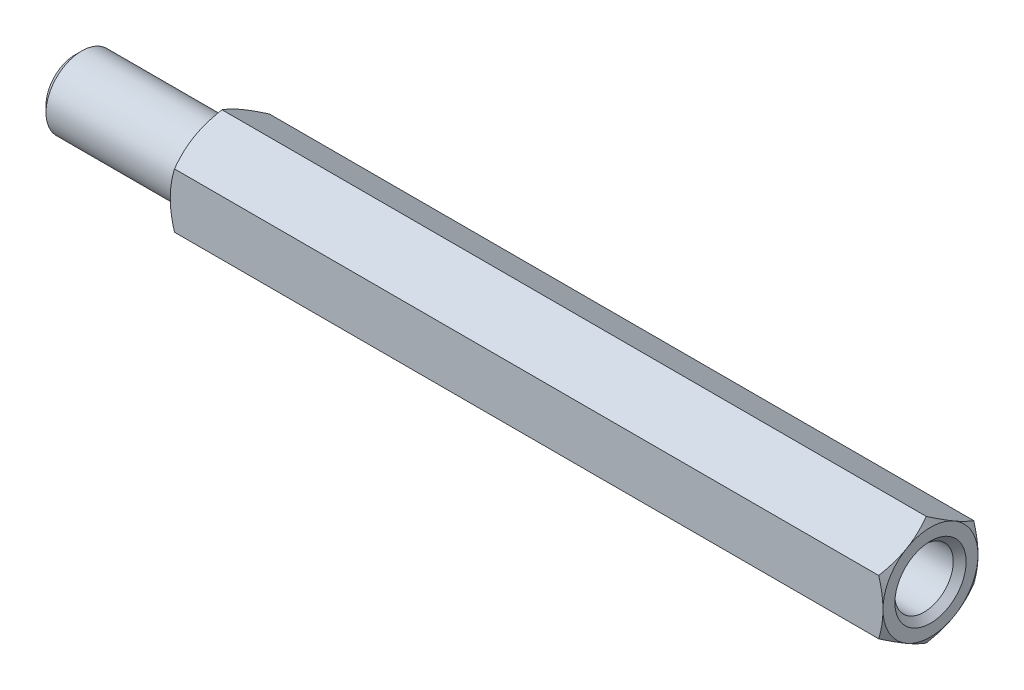
ISO-10303-21;
HEADER;
FILE_DESCRIPTION(('STEP AP214'),'2;1');
FILE_NAME('part.step','',(''),(''),'','','');
FILE_SCHEMA(('AUTOMOTIVE_DESIGN { 1 0 10303 214 1 1 1 1 }'));
ENDSEC;
DATA;
#1=APPLICATION_CONTEXT('core data for automotive mechanical design processes');
#2=APPLICATION_PROTOCOL_DEFINITION('international standard','automotive_design',2000,#1);
#3=PRODUCT_CONTEXT('',#1,'mechanical');
#4=PRODUCT('Part','Part','',(#3));
#5=PRODUCT_RELATED_PRODUCT_CATEGORY('part','',(#4));
#6=PRODUCT_DEFINITION_FORMATION('','',#4);
#7=PRODUCT_DEFINITION_CONTEXT('part definition',#1,'design');
#8=PRODUCT_DEFINITION('design','',#6,#7);
#9=PRODUCT_DEFINITION_SHAPE('','',#8);
#10=(LENGTH_UNIT() NAMED_UNIT(*) SI_UNIT(.MILLI.,.METRE.));
#11=(NAMED_UNIT(*) PLANE_ANGLE_UNIT() SI_UNIT($,.RADIAN.));
#12=(NAMED_UNIT(*) SI_UNIT($,.STERADIAN.) SOLID_ANGLE_UNIT());
#13=UNCERTAINTY_MEASURE_WITH_UNIT(LENGTH_MEASURE(1.E-05),#10,'distance_accuracy_value','');
#14=(GEOMETRIC_REPRESENTATION_CONTEXT(3) GLOBAL_UNCERTAINTY_ASSIGNED_CONTEXT((#13)) GLOBAL_UNIT_ASSIGNED_CONTEXT((#10,
#11,#12)) REPRESENTATION_CONTEXT('',''));
#15=CARTESIAN_POINT('',(0.,0.,0.));
#16=DIRECTION('',(0.,0.,1.));
#17=DIRECTION('',(1.,0.,0.));
#18=AXIS2_PLACEMENT_3D('',#15,#16,#17);
#19=CARTESIAN_POINT('',(36.,-2.,0.));
#20=DIRECTION('',(1.,0.,0.));
#21=DIRECTION('',(0.,0.,1.));
#22=AXIS2_PLACEMENT_3D('',#19,#20,#21);
#23=PLANE('',#22);
#24=CARTESIAN_POINT('',(36.,0.,0.));
#25=DIRECTION('',(-1.,0.,0.));
#26=DIRECTION('',(0.,0.,-1.));
#27=AXIS2_PLACEMENT_3D('',#24,#25,#26);
#28=CIRCLE('',#27,2.);
#29=CARTESIAN_POINT('',(36.,0.,-2.));
#30=VERTEX_POINT('',#29);
#31=CARTESIAN_POINT('',(36.,-1.73205080756887,-1.));
#32=VERTEX_POINT('',#31);
#33=EDGE_CURVE('E358',#30,#32,#28,.T.);
#34=ORIENTED_EDGE('',*,*,#33,.F.);
#35=CARTESIAN_POINT('',(36.,1.73205080756888,-1.));
#36=VERTEX_POINT('',#35);
#37=EDGE_CURVE('E364',#36,#30,#28,.T.);
#38=ORIENTED_EDGE('',*,*,#37,.F.);
#39=CARTESIAN_POINT('',(36.,1.73205080756888,1.));
#40=VERTEX_POINT('',#39);
#41=EDGE_CURVE('E375',#40,#36,#28,.T.);
#42=ORIENTED_EDGE('',*,*,#41,.F.);
#43=CARTESIAN_POINT('',(36.,0.,2.));
#44=VERTEX_POINT('',#43);
#45=EDGE_CURVE('E384',#44,#40,#28,.T.);
#46=ORIENTED_EDGE('',*,*,#45,.F.);
#47=CARTESIAN_POINT('',(36.,-1.73205080756887,1.));
#48=VERTEX_POINT('',#47);
#49=EDGE_CURVE('E372',#48,#44,#28,.T.);
#50=ORIENTED_EDGE('',*,*,#49,.F.);
#51=EDGE_CURVE('E363',#32,#48,#28,.T.);
#52=ORIENTED_EDGE('',*,*,#51,.F.);
#53=EDGE_LOOP('',(#34,#38,#42,#46,#50,#52));
#54=FACE_BOUND('',#53,.T.);
#55=CARTESIAN_POINT('',(36.,0.,0.));
#56=DIRECTION('',(1.,0.,0.));
#57=DIRECTION('',(0.,0.,-1.));
#58=AXIS2_PLACEMENT_3D('',#55,#56,#57);
#59=CIRCLE('',#58,1.5);
#60=CARTESIAN_POINT('',(36.,0.,-1.5));
#61=VERTEX_POINT('',#60);
#62=EDGE_CURVE('E424',#61,#61,#59,.T.);
#63=ORIENTED_EDGE('',*,*,#62,.F.);
#64=EDGE_LOOP('',(#63));
#65=FACE_BOUND('',#64,.T.);
#66=ADVANCED_FACE('F16',(#54,#65),#23,.T.);
#67=CARTESIAN_POINT('',(6.,0.,0.));
#68=DIRECTION('',(1.,0.,0.));
#69=DIRECTION('',(0.,0.,1.));
#70=AXIS2_PLACEMENT_3D('',#67,#68,#69);
#71=CONICAL_SURFACE('',#70,2.,1.0471975511966);
#72=CARTESIAN_POINT('',(6.17863346162125,2.30940223145904,1.99999999944489E-06));
#73=CARTESIAN_POINT('',(6.14932895199077,2.25866011643009,-0.0878859213136436));
#74=CARTESIAN_POINT('',(6.12267802580262,2.207479996229,-0.176532489839422));
#75=CARTESIAN_POINT('',(6.07615961538896,2.10423360469228,-0.355360485679156));
#76=CARTESIAN_POINT('',(6.0563085858507,2.0521654994535,-0.445545089406572));
#77=CARTESIAN_POINT('',(6.02540900094905,1.94867454348799,-0.624796683262704));
#78=CARTESIAN_POINT('',(6.01415476818945,1.89726761179017,-0.713836100824559));
#79=CARTESIAN_POINT('',(6.00072203002947,1.79421198570273,-0.892333681213829));
#80=CARTESIAN_POINT('',(5.99853239853992,1.74256366563992,-0.981791195688201));
#81=CARTESIAN_POINT('',(6.00309900412139,1.64606416810295,-1.14893322832709));
#82=CARTESIAN_POINT('',(6.00873398809828,1.60119851072437,-1.22664282642177));
#83=CARTESIAN_POINT('',(6.02659003366544,1.51175948134918,-1.38155576947924));
#84=CARTESIAN_POINT('',(6.03881718898506,1.46718641847169,-1.45875857903201));
#85=CARTESIAN_POINT('',(6.0693827363734,1.37756313348883,-1.61399066216355));
#86=CARTESIAN_POINT('',(6.08785063445977,1.33252424880493,-1.69200029875231));
#87=CARTESIAN_POINT('',(6.12976496538875,1.2431180434402,-1.84685638895596));
#88=CARTESIAN_POINT('',(6.15320155623483,1.1987495782296,-1.92370482495456));
#89=CARTESIAN_POINT('',(6.17863346162125,1.15469938367871,-2.000002));
#90=B_SPLINE_CURVE_WITH_KNOTS('',3,(#72,#73,#74,#75,#76,#77,#78,#79,#80,#81,#82,#83,#84,#85,#86,
#87,#88,#89),.UNSPECIFIED.,.F.,.F.,(4,2,2,2,2,2,2,2,4),(0.,0.317016169677224,0.634794137597965,
0.944708069734768,1.25424149376515,1.52370940950263,1.79342684652008,2.06912535534026,
2.34428277883518),.UNSPECIFIED.);
#91=CARTESIAN_POINT('',(6.,1.73205080756887,-1.));
#92=VERTEX_POINT('',#91);
#93=CARTESIAN_POINT('',(6.17863279495408,1.15470053837925,-2.));
#94=VERTEX_POINT('',#93);
#95=EDGE_CURVE('E229',#92,#94,#90,.T.);
#96=ORIENTED_EDGE('',*,*,#95,.T.);
#97=CARTESIAN_POINT('',(6.95707659511875,3.06248395664288,-2.));
#98=CARTESIAN_POINT('',(6.91464094017905,2.9746722733121,-2.));
#99=CARTESIAN_POINT('',(6.87262711614704,2.88665297969014,-2.));
#100=CARTESIAN_POINT('',(6.78968417732636,2.710086917094,-2.));
#101=CARTESIAN_POINT('',(6.74875525033175,2.62154006000655,-2.));
#102=CARTESIAN_POINT('',(6.66800754764852,2.44332831641312,-2.));
#103=CARTESIAN_POINT('',(6.62819646480048,2.35365993164817,-2.));
#104=CARTESIAN_POINT('',(6.55028421305972,2.17358618521591,-2.));
#105=CARTESIAN_POINT('',(6.51218295504112,2.08318086225299,-2.));
#106=CARTESIAN_POINT('',(6.43768872250672,1.90035743198857,-2.));
#107=CARTESIAN_POINT('',(6.40132274608054,1.80792826318448,-2.));
#108=CARTESIAN_POINT('',(6.33144643028004,1.62199878370985,-2.));
#109=CARTESIAN_POINT('',(6.29793581959282,1.52849857576785,-2.));
#110=CARTESIAN_POINT('',(6.23465884419016,1.3404418896284,-2.));
#111=CARTESIAN_POINT('',(6.2048848904417,1.24588799135971,-2.));
#112=CARTESIAN_POINT('',(6.15005211733538,1.05543603830702,-2.));
#113=CARTESIAN_POINT('',(6.12499180693315,0.959538418924565,-2.));
#114=CARTESIAN_POINT('',(6.08080314458629,0.766333296096984,-2.));
#115=CARTESIAN_POINT('',(6.0616763695491,0.66902542504041,-2.));
#116=CARTESIAN_POINT('',(6.03064164748494,0.473237162855792,-2.));
#117=CARTESIAN_POINT('',(6.01873370678747,0.374756770699752,-2.));
#118=CARTESIAN_POINT('',(6.0031933887613,0.177759063697086,-2.));
#119=CARTESIAN_POINT('',(5.99950861546338,0.0792460061622585,-2.));
#120=CARTESIAN_POINT('',(6.00059810556417,-0.117701135106232,-2.));
#121=CARTESIAN_POINT('',(6.00537017292069,-0.216135232703554,-2.));
#122=CARTESIAN_POINT('',(6.02672018473349,-0.454264467586988,-2.));
#123=CARTESIAN_POINT('',(6.04747725356995,-0.593585687387204,-2.));
#124=CARTESIAN_POINT('',(6.10219060032751,-0.869650578828696,-2.));
#125=CARTESIAN_POINT('',(6.13616240699579,-1.00639101882147,-2.));
#126=CARTESIAN_POINT('',(6.19474597023689,-1.2110436826886,-2.));
#127=CARTESIAN_POINT('',(6.2158434000136,-1.28000229249774,-2.));
#128=CARTESIAN_POINT('',(6.26012672651208,-1.41719592389101,-2.));
#129=CARTESIAN_POINT('',(6.28331118279096,-1.4854314087592,-2.));
#130=CARTESIAN_POINT('',(6.33128524404832,-1.6208983000868,-2.));
#131=CARTESIAN_POINT('',(6.3560650798224,-1.68813319631837,-2.));
#132=CARTESIAN_POINT('',(6.40707926081629,-1.82208132860788,-2.));
#133=CARTESIAN_POINT('',(6.43331419385887,-1.88879434123597,-2.));
#134=CARTESIAN_POINT('',(6.46013317476923,-1.95526565033059,-2.));
#135=B_SPLINE_CURVE_WITH_KNOTS('',3,(#97,#98,#99,#100,#101,#102,#103,#104,#105,#106,#107,#108,
#109,#110,#111,#112,#113,#114,#115,#116,#117,#118,#119,#120,#121,#122,#123,#124,#125,#126,#127,
#128,#129,#130,#131,#132,#133,#134),.UNSPECIFIED.,.F.,.F.,(4,2,2,2,2,2,2,2,2,2,2,2,2,2,2,2,2,2,
4),(0.,0.292587400421558,0.585225120850307,0.879537405001901,1.17383433004548,1.47177575786305,
1.76968884405566,2.06698673461392,2.36419042360325,2.66147303046827,2.95875589799185,
3.25413907875105,3.54944556669909,3.97115758871593,4.39336667236419,4.60968240779144,
4.82584997270491,5.04080082213791,5.25583914790371),.UNSPECIFIED.);
#136=CARTESIAN_POINT('',(6.,0.,-2.));
#137=VERTEX_POINT('',#136);
#138=EDGE_CURVE('E228',#94,#137,#135,.T.);
#139=ORIENTED_EDGE('',*,*,#138,.T.);
#140=CARTESIAN_POINT('',(6.,0.,0.));
#141=DIRECTION('',(-1.,0.,0.));
#142=DIRECTION('',(0.,0.,-1.));
#143=AXIS2_PLACEMENT_3D('',#140,#141,#142);
#144=CIRCLE('',#143,2.);
#145=EDGE_CURVE('E349',#92,#137,#144,.T.);
#146=ORIENTED_EDGE('',*,*,#145,.F.);
#147=EDGE_LOOP('',(#96,#139,#146));
#148=FACE_BOUND('',#147,.T.);
#149=ADVANCED_FACE('F129',(#148),#71,.T.);
#150=CARTESIAN_POINT('',(6.,-1.73205080756888,-1.));
#151=VERTEX_POINT('',#150);
#152=EDGE_CURVE('E338',#137,#151,#144,.T.);
#153=ORIENTED_EDGE('',*,*,#152,.F.);
#154=CARTESIAN_POINT('',(6.17863279495408,-1.15470053837925,-2.));
#155=VERTEX_POINT('',#154);
#156=EDGE_CURVE('E221',#137,#155,#135,.T.);
#157=ORIENTED_EDGE('',*,*,#156,.T.);
#158=CARTESIAN_POINT('',(6.17863346162125,-1.15469938367871,-2.000002));
#159=CARTESIAN_POINT('',(6.14932895199078,-1.20544149870766,-1.91211407868636));
#160=CARTESIAN_POINT('',(6.12267802580262,-1.25662161890876,-1.82346751016058));
#161=CARTESIAN_POINT('',(6.07615961538896,-1.35986801044547,-1.64463951432084));
#162=CARTESIAN_POINT('',(6.0563085858507,-1.41193611568425,-1.55445491059343));
#163=CARTESIAN_POINT('',(6.02540900094906,-1.51542707164976,-1.3752033167373));
#164=CARTESIAN_POINT('',(6.01415476818945,-1.56683400334758,-1.28616389917544));
#165=CARTESIAN_POINT('',(6.00072203002947,-1.66988962943502,-1.10766631878617));
#166=CARTESIAN_POINT('',(5.99853239853992,-1.72153794949784,-1.0182088043118));
#167=CARTESIAN_POINT('',(6.00309900412139,-1.8180374470348,-0.851066771672908));
#168=CARTESIAN_POINT('',(6.00873398809828,-1.86290310441338,-0.773357173578229));
#169=CARTESIAN_POINT('',(6.02659003366544,-1.95234213378857,-0.61844423052076));
#170=CARTESIAN_POINT('',(6.03881718898506,-1.99691519666606,-0.541241420967985));
#171=CARTESIAN_POINT('',(6.0693827363734,-2.08653848164892,-0.386009337836449));
#172=CARTESIAN_POINT('',(6.08785063445977,-2.13157736633282,-0.30799970124769));
#173=CARTESIAN_POINT('',(6.12976496538875,-2.22098357169755,-0.153143611044043));
#174=CARTESIAN_POINT('',(6.15320155623483,-2.26535203690815,-0.0762951750454383));
#175=CARTESIAN_POINT('',(6.17863346162125,-2.30940223145904,2.00000000004646E-06));
#176=B_SPLINE_CURVE_WITH_KNOTS('',3,(#158,#159,#160,#161,#162,#163,#164,#165,#166,#167,#168,
#169,#170,#171,#172,#173,#174,#175),.UNSPECIFIED.,.F.,.F.,(4,2,2,2,2,2,2,2,4),(0.,
0.317016169677224,0.634794137597965,0.944708069734768,1.25424149376515,1.52370940950263,
1.79342684652008,2.06912535534026,2.34428277883518),.UNSPECIFIED.);
#177=EDGE_CURVE('E215',#155,#151,#176,.T.);
#178=ORIENTED_EDGE('',*,*,#177,.T.);
#179=EDGE_LOOP('',(#153,#157,#178));
#180=FACE_BOUND('',#179,.T.);
#181=ADVANCED_FACE('F135',(#180),#71,.T.);
#182=CARTESIAN_POINT('',(6.,-1.73205080756887,1.));
#183=VERTEX_POINT('',#182);
#184=EDGE_CURVE('E341',#151,#183,#144,.T.);
#185=ORIENTED_EDGE('',*,*,#184,.F.);
#186=CARTESIAN_POINT('',(6.17863279495408,-2.30940107675851,0.));
#187=VERTEX_POINT('',#186);
#188=EDGE_CURVE('E207',#151,#187,#176,.T.);
#189=ORIENTED_EDGE('',*,*,#188,.T.);
#190=CARTESIAN_POINT('',(6.17863346162125,-2.30940223145904,-1.99999999985859E-06));
#191=CARTESIAN_POINT('',(6.14932895199078,-2.25866011643009,0.0878859213136433));
#192=CARTESIAN_POINT('',(6.12267802580262,-2.207479996229,0.176532489839422));
#193=CARTESIAN_POINT('',(6.07615961538896,-2.10423360469229,0.355360485679155));
#194=CARTESIAN_POINT('',(6.0563085858507,-2.0521654994535,0.445545089406571));
#195=CARTESIAN_POINT('',(6.02540900094906,-1.94867454348799,0.624796683262702));
#196=CARTESIAN_POINT('',(6.01415476818945,-1.89726761179017,0.713836100824558));
#197=CARTESIAN_POINT('',(6.00072203002947,-1.79421198570273,0.892333681213828));
#198=CARTESIAN_POINT('',(5.99853239853992,-1.74256366563992,0.981791195688199));
#199=CARTESIAN_POINT('',(6.00309900412139,-1.64606416810295,1.14893322832709));
#200=CARTESIAN_POINT('',(6.00873398809828,-1.60119851072437,1.22664282642177));
#201=CARTESIAN_POINT('',(6.02659003366544,-1.51175948134918,1.38155576947924));
#202=CARTESIAN_POINT('',(6.03881718898506,-1.46718641847169,1.45875857903201));
#203=CARTESIAN_POINT('',(6.0693827363734,-1.37756313348883,1.61399066216355));
#204=CARTESIAN_POINT('',(6.08785063445977,-1.33252424880493,1.69200029875231));
#205=CARTESIAN_POINT('',(6.12976496538875,-1.2431180434402,1.84685638895596));
#206=CARTESIAN_POINT('',(6.15320155623483,-1.1987495782296,1.92370482495456));
#207=CARTESIAN_POINT('',(6.17863346162125,-1.15469938367871,2.000002));
#208=B_SPLINE_CURVE_WITH_KNOTS('',3,(#190,#191,#192,#193,#194,#195,#196,#197,#198,#199,#200,
#201,#202,#203,#204,#205,#206,#207),.UNSPECIFIED.,.F.,.F.,(4,2,2,2,2,2,2,2,4),(0.,
0.317016169677224,0.634794137597964,0.944708069734767,1.25424149376515,1.52370940950263,
1.79342684652008,2.06912535534026,2.34428277883518),.UNSPECIFIED.);
#209=EDGE_CURVE('E305',#187,#183,#208,.T.);
#210=ORIENTED_EDGE('',*,*,#209,.T.);
#211=EDGE_LOOP('',(#185,#189,#210));
#212=FACE_BOUND('',#211,.T.);
#213=ADVANCED_FACE('F342',(#212),#71,.T.);
#214=CARTESIAN_POINT('',(6.17863346162125,1.15469938367871,2.000002));
#215=CARTESIAN_POINT('',(6.14932895199077,1.20544149870766,1.91211407868636));
#216=CARTESIAN_POINT('',(6.12267802580262,1.25662161890876,1.82346751016058));
#217=CARTESIAN_POINT('',(6.07615961538896,1.35986801044547,1.64463951432084));
#218=CARTESIAN_POINT('',(6.0563085858507,1.41193611568425,1.55445491059343));
#219=CARTESIAN_POINT('',(6.02540900094906,1.51542707164976,1.3752033167373));
#220=CARTESIAN_POINT('',(6.01415476818945,1.56683400334758,1.28616389917544));
#221=CARTESIAN_POINT('',(6.00072203002947,1.66988962943503,1.10766631878617));
#222=CARTESIAN_POINT('',(5.99853239853992,1.72153794949784,1.0182088043118));
#223=CARTESIAN_POINT('',(6.00309900412139,1.8180374470348,0.851066771672908));
#224=CARTESIAN_POINT('',(6.00873398809828,1.86290310441338,0.773357173578229));
#225=CARTESIAN_POINT('',(6.02659003366544,1.95234213378857,0.61844423052076));
#226=CARTESIAN_POINT('',(6.03881718898506,1.99691519666606,0.541241420967985));
#227=CARTESIAN_POINT('',(6.0693827363734,2.08653848164892,0.38600933783645));
#228=CARTESIAN_POINT('',(6.08785063445977,2.13157736633283,0.307999701247691));
#229=CARTESIAN_POINT('',(6.12976496538875,2.22098357169755,0.153143611044043));
#230=CARTESIAN_POINT('',(6.15320155623483,2.26535203690815,0.076295175045438));
#231=CARTESIAN_POINT('',(6.17863346162125,2.30940223145904,-2.00000000084066E-06));
#232=B_SPLINE_CURVE_WITH_KNOTS('',3,(#214,#215,#216,#217,#218,#219,#220,#221,#222,#223,#224,
#225,#226,#227,#228,#229,#230,#231),.UNSPECIFIED.,.F.,.F.,(4,2,2,2,2,2,2,2,4),(0.,
0.317016169677224,0.634794137597965,0.944708069734768,1.25424149376515,1.52370940950263,
1.79342684652008,2.06912535534026,2.34428277883518),.UNSPECIFIED.);
#233=CARTESIAN_POINT('',(6.,1.73205080756888,1.));
#234=VERTEX_POINT('',#233);
#235=CARTESIAN_POINT('',(6.17863279495408,2.30940107675851,0.));
#236=VERTEX_POINT('',#235);
#237=EDGE_CURVE('E300',#234,#236,#232,.T.);
#238=ORIENTED_EDGE('',*,*,#237,.T.);
#239=EDGE_CURVE('E216',#236,#92,#90,.T.);
#240=ORIENTED_EDGE('',*,*,#239,.T.);
#241=EDGE_CURVE('E357',#234,#92,#144,.T.);
#242=ORIENTED_EDGE('',*,*,#241,.F.);
#243=EDGE_LOOP('',(#238,#240,#242));
#244=FACE_BOUND('',#243,.T.);
#245=ADVANCED_FACE('F675',(#244),#71,.T.);
#246=CARTESIAN_POINT('',(6.,0.,2.));
#247=VERTEX_POINT('',#246);
#248=EDGE_CURVE('E346',#183,#247,#144,.T.);
#249=ORIENTED_EDGE('',*,*,#248,.F.);
#250=CARTESIAN_POINT('',(6.17863279495408,-1.15470053837925,2.));
#251=VERTEX_POINT('',#250);
#252=EDGE_CURVE('E33',#183,#251,#208,.T.);
#253=ORIENTED_EDGE('',*,*,#252,.T.);
#254=CARTESIAN_POINT('',(6.95707659511875,3.06248395664288,2.));
#255=CARTESIAN_POINT('',(6.91464094017906,2.9746722733121,2.));
#256=CARTESIAN_POINT('',(6.87262711614704,2.88665297969014,2.));
#257=CARTESIAN_POINT('',(6.78968417732636,2.710086917094,2.));
#258=CARTESIAN_POINT('',(6.74875525033175,2.62154006000655,2.));
#259=CARTESIAN_POINT('',(6.66800754764852,2.44332831641312,2.));
#260=CARTESIAN_POINT('',(6.62819646480048,2.35365993164817,2.));
#261=CARTESIAN_POINT('',(6.55028421305972,2.17358618521591,2.));
#262=CARTESIAN_POINT('',(6.51218295504112,2.083180862253,2.));
#263=CARTESIAN_POINT('',(6.43768872250672,1.90035743198857,2.));
#264=CARTESIAN_POINT('',(6.40132274608054,1.80792826318449,2.));
#265=CARTESIAN_POINT('',(6.33144643028004,1.62199878370985,2.));
#266=CARTESIAN_POINT('',(6.29793581959282,1.52849857576785,2.));
#267=CARTESIAN_POINT('',(6.23465884419016,1.34044188962841,2.));
#268=CARTESIAN_POINT('',(6.20488489044171,1.24588799135971,2.));
#269=CARTESIAN_POINT('',(6.15005211733538,1.05543603830702,2.));
#270=CARTESIAN_POINT('',(6.12499180693315,0.959538418924566,2.));
#271=CARTESIAN_POINT('',(6.08080314458629,0.766333296096985,2.));
#272=CARTESIAN_POINT('',(6.0616763695491,0.669025425040411,2.));
#273=CARTESIAN_POINT('',(6.03064164748494,0.473237162855793,2.));
#274=CARTESIAN_POINT('',(6.01873370678747,0.374756770699753,2.));
#275=CARTESIAN_POINT('',(6.0031933887613,0.177759063697087,2.));
#276=CARTESIAN_POINT('',(5.99950861546338,0.0792460061622601,2.));
#277=CARTESIAN_POINT('',(6.00059810556417,-0.11770113510623,2.));
#278=CARTESIAN_POINT('',(6.00537017292069,-0.216135232703552,2.));
#279=CARTESIAN_POINT('',(6.02672018473349,-0.454264467586986,2.));
#280=CARTESIAN_POINT('',(6.04747725356995,-0.593585687387203,2.));
#281=CARTESIAN_POINT('',(6.10219060032751,-0.869650578828695,2.));
#282=CARTESIAN_POINT('',(6.13616240699579,-1.00639101882147,2.));
#283=CARTESIAN_POINT('',(6.19474597023689,-1.2110436826886,2.));
#284=CARTESIAN_POINT('',(6.21584340001361,-1.28000229249774,2.));
#285=CARTESIAN_POINT('',(6.26012672651208,-1.41719592389101,2.));
#286=CARTESIAN_POINT('',(6.28331118279096,-1.4854314087592,2.));
#287=CARTESIAN_POINT('',(6.33128524404832,-1.6208983000868,2.));
#288=CARTESIAN_POINT('',(6.3560650798224,-1.68813319631837,2.));
#289=CARTESIAN_POINT('',(6.40707926081629,-1.82208132860788,2.));
#290=CARTESIAN_POINT('',(6.43331419385887,-1.88879434123597,2.));
#291=CARTESIAN_POINT('',(6.46013317476923,-1.95526565033059,2.));
#292=B_SPLINE_CURVE_WITH_KNOTS('',3,(#254,#255,#256,#257,#258,#259,#260,#261,#262,#263,#264,
#265,#266,#267,#268,#269,#270,#271,#272,#273,#274,#275,#276,#277,#278,#279,#280,#281,#282,#283,
#284,#285,#286,#287,#288,#289,#290,#291),.UNSPECIFIED.,.F.,.F.,(4,2,2,2,2,2,2,2,2,2,2,2,2,2,2,2,
2,2,4),(0.,0.292587400421558,0.585225120850306,0.8795374050019,1.17383433004548,
1.47177575786305,1.76968884405566,2.06698673461392,2.36419042360325,2.66147303046827,
2.95875589799185,3.25413907875105,3.54944556669909,3.97115758871593,4.39336667236419,
4.60968240779144,4.82584997270491,5.04080082213791,5.25583914790371),.UNSPECIFIED.);
#293=EDGE_CURVE('E26',#251,#247,#292,.F.);
#294=ORIENTED_EDGE('',*,*,#293,.T.);
#295=EDGE_LOOP('',(#249,#253,#294));
#296=FACE_BOUND('',#295,.T.);
#297=ADVANCED_FACE('F666',(#296),#71,.T.);
#298=CARTESIAN_POINT('',(6.17863279495408,1.15470053837925,2.));
#299=VERTEX_POINT('',#298);
#300=EDGE_CURVE('E262',#247,#299,#292,.F.);
#301=ORIENTED_EDGE('',*,*,#300,.T.);
#302=EDGE_CURVE('E295',#299,#234,#232,.T.);
#303=ORIENTED_EDGE('',*,*,#302,.T.);
#304=EDGE_CURVE('E360',#247,#234,#144,.T.);
#305=ORIENTED_EDGE('',*,*,#304,.F.);
#306=EDGE_LOOP('',(#301,#303,#305));
#307=FACE_BOUND('',#306,.T.);
#308=ADVANCED_FACE('F138',(#307),#71,.T.);
#309=CARTESIAN_POINT('',(6.,0.,0.));
#310=DIRECTION('',(-1.,0.,0.));
#311=DIRECTION('',(0.,0.,-1.));
#312=AXIS2_PLACEMENT_3D('',#309,#310,#311);
#313=PLANE('',#312);
#314=CARTESIAN_POINT('',(6.,0.,0.));
#315=DIRECTION('',(-1.,0.,0.));
#316=DIRECTION('',(0.,-1.,0.));
#317=AXIS2_PLACEMENT_3D('',#314,#315,#316);
#318=CIRCLE('',#317,1.229375);
#319=CARTESIAN_POINT('',(6.,-1.229375,0.));
#320=VERTEX_POINT('',#319);
#321=EDGE_CURVE('E11',#320,#320,#318,.T.);
#322=ORIENTED_EDGE('',*,*,#321,.F.);
#323=EDGE_LOOP('',(#322));
#324=FACE_BOUND('',#323,.T.);
#325=ORIENTED_EDGE('',*,*,#152,.T.);
#326=ORIENTED_EDGE('',*,*,#184,.T.);
#327=ORIENTED_EDGE('',*,*,#248,.T.);
#328=ORIENTED_EDGE('',*,*,#304,.T.);
#329=ORIENTED_EDGE('',*,*,#241,.T.);
#330=ORIENTED_EDGE('',*,*,#145,.T.);
#331=EDGE_LOOP('',(#325,#326,#327,#328,#329,#330));
#332=FACE_BOUND('',#331,.T.);
#333=ADVANCED_FACE('F287',(#324,#332),#313,.T.);
#334=CARTESIAN_POINT('',(37.,-1.15470053837925,2.));
#335=DIRECTION('',(0.,0.866025403784439,-0.5));
#336=DIRECTION('',(0.,0.5,0.866025403784439));
#337=AXIS2_PLACEMENT_3D('',#334,#335,#336);
#338=PLANE('',#337);
#339=ORIENTED_EDGE('',*,*,#209,.F.);
#340=DIRECTION('',(-1.,0.,0.));
#341=VECTOR('',#340,1.);
#342=CARTESIAN_POINT('',(37.,-2.3094010767585,0.));
#343=LINE('',#342,#341);
#344=CARTESIAN_POINT('',(35.821367205046,-2.3094010767585,0.));
#345=VERTEX_POINT('',#344);
#346=EDGE_CURVE('E247',#345,#187,#343,.T.);
#347=ORIENTED_EDGE('',*,*,#346,.F.);
#348=CARTESIAN_POINT('',(35.8213665383788,-1.15469938367871,2.000002));
#349=CARTESIAN_POINT('',(35.8506710480092,-1.20544149870766,1.91211407868635));
#350=CARTESIAN_POINT('',(35.8773219741974,-1.25662161890876,1.82346751016057));
#351=CARTESIAN_POINT('',(35.923840384611,-1.35986801044547,1.64463951432084));
#352=CARTESIAN_POINT('',(35.9436914141493,-1.41193611568425,1.55445491059343));
#353=CARTESIAN_POINT('',(35.9745909990509,-1.51542707164976,1.3752033167373));
#354=CARTESIAN_POINT('',(35.9858452318105,-1.56683400334758,1.28616389917544));
#355=CARTESIAN_POINT('',(35.9992779699705,-1.66988962943502,1.10766631878617));
#356=CARTESIAN_POINT('',(36.0014676014601,-1.72153794949783,1.0182088043118));
#357=CARTESIAN_POINT('',(35.9969009958786,-1.8180374470348,0.85106677167291));
#358=CARTESIAN_POINT('',(35.9912660119017,-1.86290310441338,0.773357173578231));
#359=CARTESIAN_POINT('',(35.9734099663345,-1.95234213378857,0.618444230520763));
#360=CARTESIAN_POINT('',(35.9611828110149,-1.99691519666606,0.541241420967987));
#361=CARTESIAN_POINT('',(35.9306172636266,-2.08653848164891,0.386009337836451));
#362=CARTESIAN_POINT('',(35.9121493655402,-2.13157736633282,0.307999701247693));
#363=CARTESIAN_POINT('',(35.8702350346112,-2.22098357169755,0.153143611044046));
#364=CARTESIAN_POINT('',(35.8467984437652,-2.26535203690815,0.0762951750454403));
#365=CARTESIAN_POINT('',(35.8213665383788,-2.30940223145904,-1.99999999997835E-06));
#366=B_SPLINE_CURVE_WITH_KNOTS('',3,(#348,#349,#350,#351,#352,#353,#354,#355,#356,#357,#358,
#359,#360,#361,#362,#363,#364,#365),.UNSPECIFIED.,.F.,.F.,(4,2,2,2,2,2,2,2,4),(0.,
0.317016169677224,0.634794137597962,0.944708069734765,1.25424149376515,1.52370940950262,
1.79342684652007,2.06912535534026,2.34428277883517),.UNSPECIFIED.);
#367=EDGE_CURVE('E40',#48,#345,#366,.T.);
#368=ORIENTED_EDGE('',*,*,#367,.F.);
#369=CARTESIAN_POINT('',(35.821367205046,-1.15470053837925,2.));
#370=VERTEX_POINT('',#369);
#371=EDGE_CURVE('E299',#370,#48,#366,.T.);
#372=ORIENTED_EDGE('',*,*,#371,.F.);
#373=DIRECTION('',(-1.,0.,0.));
#374=VECTOR('',#373,1.);
#375=CARTESIAN_POINT('',(37.,-1.15470053837925,2.));
#376=LINE('',#375,#374);
#377=EDGE_CURVE('E230',#370,#251,#376,.T.);
#378=ORIENTED_EDGE('',*,*,#377,.T.);
#379=ORIENTED_EDGE('',*,*,#252,.F.);
#380=EDGE_LOOP('',(#339,#347,#368,#372,#378,#379));
#381=FACE_BOUND('',#380,.T.);
#382=ADVANCED_FACE('F18',(#381),#338,.F.);
#383=CARTESIAN_POINT('',(37.,-2.3094010767585,0.));
#384=DIRECTION('',(0.,0.866025403784439,0.5));
#385=DIRECTION('',(0.,-0.5,0.866025403784439));
#386=AXIS2_PLACEMENT_3D('',#383,#384,#385);
#387=PLANE('',#386);
#388=ORIENTED_EDGE('',*,*,#177,.F.);
#389=DIRECTION('',(-1.,0.,0.));
#390=VECTOR('',#389,1.);
#391=CARTESIAN_POINT('',(37.,-1.15470053837925,-2.));
#392=LINE('',#391,#390);
#393=CARTESIAN_POINT('',(35.8213672050459,-1.15470053837925,-2.));
#394=VERTEX_POINT('',#393);
#395=EDGE_CURVE('E244',#394,#155,#392,.T.);
#396=ORIENTED_EDGE('',*,*,#395,.F.);
#397=CARTESIAN_POINT('',(35.8213665383788,-2.30940223145904,2.00000000040761E-06));
#398=CARTESIAN_POINT('',(35.8506710480092,-2.25866011643009,-0.087885921313645));
#399=CARTESIAN_POINT('',(35.8773219741974,-2.20747999622899,-0.176532489839425));
#400=CARTESIAN_POINT('',(35.923840384611,-2.10423360469228,-0.355360485679158));
#401=CARTESIAN_POINT('',(35.9436914141493,-2.0521654994535,-0.445545089406574));
#402=CARTESIAN_POINT('',(35.9745909990509,-1.94867454348799,-0.624796683262704));
#403=CARTESIAN_POINT('',(35.9858452318105,-1.89726761179017,-0.713836100824559));
#404=CARTESIAN_POINT('',(35.9992779699705,-1.79421198570273,-0.892333681213829));
#405=CARTESIAN_POINT('',(36.0014676014601,-1.74256366563992,-0.9817911956882));
#406=CARTESIAN_POINT('',(35.9969009958786,-1.64606416810295,-1.14893322832709));
#407=CARTESIAN_POINT('',(35.9912660119017,-1.60119851072437,-1.22664282642177));
#408=CARTESIAN_POINT('',(35.9734099663345,-1.51175948134918,-1.38155576947924));
#409=CARTESIAN_POINT('',(35.9611828110149,-1.46718641847169,-1.45875857903201));
#410=CARTESIAN_POINT('',(35.9306172636266,-1.37756313348883,-1.61399066216355));
#411=CARTESIAN_POINT('',(35.9121493655402,-1.33252424880493,-1.69200029875231));
#412=CARTESIAN_POINT('',(35.8702350346112,-1.2431180434402,-1.84685638895595));
#413=CARTESIAN_POINT('',(35.8467984437652,-1.1987495782296,-1.92370482495456));
#414=CARTESIAN_POINT('',(35.8213665383788,-1.15469938367871,-2.000002));
#415=B_SPLINE_CURVE_WITH_KNOTS('',3,(#397,#398,#399,#400,#401,#402,#403,#404,#405,#406,#407,
#408,#409,#410,#411,#412,#413,#414),.UNSPECIFIED.,.F.,.F.,(4,2,2,2,2,2,2,2,4),(0.,
0.317016169677225,0.634794137597962,0.944708069734765,1.25424149376515,1.52370940950262,
1.79342684652007,2.06912535534025,2.34428277883517),.UNSPECIFIED.);
#416=EDGE_CURVE('E187',#32,#394,#415,.T.);
#417=ORIENTED_EDGE('',*,*,#416,.F.);
#418=EDGE_CURVE('E193',#345,#32,#415,.T.);
#419=ORIENTED_EDGE('',*,*,#418,.F.);
#420=ORIENTED_EDGE('',*,*,#346,.T.);
#421=ORIENTED_EDGE('',*,*,#188,.F.);
#422=EDGE_LOOP('',(#388,#396,#417,#419,#420,#421));
#423=FACE_BOUND('',#422,.T.);
#424=ADVANCED_FACE('F199',(#423),#387,.F.);
#425=CARTESIAN_POINT('',(37.,-1.15470053837925,-2.));
#426=DIRECTION('',(0.,0.,1.));
#427=DIRECTION('',(0.,-1.,0.));
#428=AXIS2_PLACEMENT_3D('',#425,#426,#427);
#429=PLANE('',#428);
#430=ORIENTED_EDGE('',*,*,#138,.F.);
#431=DIRECTION('',(-1.,0.,0.));
#432=VECTOR('',#431,1.);
#433=CARTESIAN_POINT('',(37.,1.15470053837925,-2.));
#434=LINE('',#433,#432);
#435=CARTESIAN_POINT('',(35.821367205046,1.15470053837925,-2.));
#436=VERTEX_POINT('',#435);
#437=EDGE_CURVE('E240',#436,#94,#434,.T.);
#438=ORIENTED_EDGE('',*,*,#437,.F.);
#439=CARTESIAN_POINT('',(35.0429234048813,3.06248395664288,-2.));
#440=CARTESIAN_POINT('',(35.0853590598209,2.9746722733121,-2.));
#441=CARTESIAN_POINT('',(35.1273728838529,2.88665297969014,-2.));
#442=CARTESIAN_POINT('',(35.2103158226736,2.71008691709399,-2.));
#443=CARTESIAN_POINT('',(35.2512447496682,2.62154006000655,-2.));
#444=CARTESIAN_POINT('',(35.3319924523515,2.44332831641312,-2.));
#445=CARTESIAN_POINT('',(35.3718035351995,2.35365993164817,-2.));
#446=CARTESIAN_POINT('',(35.4497157869403,2.17358618521591,-2.));
#447=CARTESIAN_POINT('',(35.4878170449589,2.083180862253,-2.));
#448=CARTESIAN_POINT('',(35.5623112774933,1.90035743198857,-2.));
#449=CARTESIAN_POINT('',(35.5986772539194,1.80792826318448,-2.));
#450=CARTESIAN_POINT('',(35.6685535697199,1.62199878370985,-2.));
#451=CARTESIAN_POINT('',(35.7020641804072,1.52849857576785,-2.));
#452=CARTESIAN_POINT('',(35.7653411558098,1.3404418896284,-2.));
#453=CARTESIAN_POINT('',(35.7951151095583,1.24588799135971,-2.));
#454=CARTESIAN_POINT('',(35.8499478826646,1.05543603830702,-2.));
#455=CARTESIAN_POINT('',(35.8750081930668,0.959538418924565,-2.));
#456=CARTESIAN_POINT('',(35.9191968554137,0.766333296096985,-2.));
#457=CARTESIAN_POINT('',(35.9383236304509,0.669025425040411,-2.));
#458=CARTESIAN_POINT('',(35.969358352515,0.473237162855792,-2.));
#459=CARTESIAN_POINT('',(35.9812662932125,0.374756770699752,-2.));
#460=CARTESIAN_POINT('',(35.9968066112387,0.177759063697087,-2.));
#461=CARTESIAN_POINT('',(36.0004913845366,0.0792460061622606,-2.));
#462=CARTESIAN_POINT('',(35.9994018944358,-0.117701135106229,-2.));
#463=CARTESIAN_POINT('',(35.9946298270793,-0.216135232703551,-2.));
#464=CARTESIAN_POINT('',(35.9732798152665,-0.454264467586982,-2.));
#465=CARTESIAN_POINT('',(35.95252274643,-0.593585687387193,-2.));
#466=CARTESIAN_POINT('',(35.8978093996725,-0.86965057882868,-2.));
#467=CARTESIAN_POINT('',(35.8638375930042,-1.00639101882145,-2.));
#468=CARTESIAN_POINT('',(35.8052540297631,-1.21104368268859,-2.));
#469=CARTESIAN_POINT('',(35.7841565999864,-1.28000229249773,-2.));
#470=CARTESIAN_POINT('',(35.7398732734879,-1.417195923891,-2.));
#471=CARTESIAN_POINT('',(35.716688817209,-1.48543140875919,-2.));
#472=CARTESIAN_POINT('',(35.6687147559517,-1.62089830008679,-2.));
#473=CARTESIAN_POINT('',(35.6439349201776,-1.68813319631836,-2.));
#474=CARTESIAN_POINT('',(35.5929207391837,-1.82208132860787,-2.));
#475=CARTESIAN_POINT('',(35.5666858061411,-1.88879434123596,-2.));
#476=CARTESIAN_POINT('',(35.5398668252308,-1.95526565033059,-2.));
#477=B_SPLINE_CURVE_WITH_KNOTS('',3,(#439,#440,#441,#442,#443,#444,#445,#446,#447,#448,#449,
#450,#451,#452,#453,#454,#455,#456,#457,#458,#459,#460,#461,#462,#463,#464,#465,#466,#467,#468,
#469,#470,#471,#472,#473,#474,#475,#476),.UNSPECIFIED.,.F.,.F.,(4,2,2,2,2,2,2,2,2,2,2,2,2,2,2,2,
2,2,4),(0.,0.292587400421552,0.585225120850299,0.879537405001893,1.17383433004547,
1.47177575786305,1.76968884405565,2.06698673461392,2.36419042360324,2.66147303046826,
2.95875589799184,3.25413907875104,3.54944556669907,3.97115758871591,4.39336667236417,
4.60968240779143,4.8258499727049,5.04080082213789,5.2558391479037),.UNSPECIFIED.);
#478=EDGE_CURVE('E181',#30,#436,#477,.F.);
#479=ORIENTED_EDGE('',*,*,#478,.F.);
#480=EDGE_CURVE('E194',#394,#30,#477,.F.);
#481=ORIENTED_EDGE('',*,*,#480,.F.);
#482=ORIENTED_EDGE('',*,*,#395,.T.);
#483=ORIENTED_EDGE('',*,*,#156,.F.);
#484=EDGE_LOOP('',(#430,#438,#479,#481,#482,#483));
#485=FACE_BOUND('',#484,.T.);
#486=ADVANCED_FACE('F202',(#485),#429,.F.);
#487=CARTESIAN_POINT('',(37.,1.15470053837925,-2.));
#488=DIRECTION('',(0.,-0.866025403784439,0.5));
#489=DIRECTION('',(0.,-0.5,-0.866025403784439));
#490=AXIS2_PLACEMENT_3D('',#487,#488,#489);
#491=PLANE('',#490);
#492=ORIENTED_EDGE('',*,*,#239,.F.);
#493=DIRECTION('',(-1.,0.,0.));
#494=VECTOR('',#493,1.);
#495=CARTESIAN_POINT('',(37.,2.30940107675851,0.));
#496=LINE('',#495,#494);
#497=CARTESIAN_POINT('',(35.8213672050459,2.30940107675851,0.));
#498=VERTEX_POINT('',#497);
#499=EDGE_CURVE('E236',#498,#236,#496,.T.);
#500=ORIENTED_EDGE('',*,*,#499,.F.);
#501=CARTESIAN_POINT('',(35.8213665383788,1.15469938367871,-2.000002));
#502=CARTESIAN_POINT('',(35.8506710480092,1.20544149870766,-1.91211407868635));
#503=CARTESIAN_POINT('',(35.8773219741974,1.25662161890876,-1.82346751016057));
#504=CARTESIAN_POINT('',(35.923840384611,1.35986801044547,-1.64463951432084));
#505=CARTESIAN_POINT('',(35.9436914141493,1.41193611568425,-1.55445491059343));
#506=CARTESIAN_POINT('',(35.9745909990509,1.51542707164976,-1.3752033167373));
#507=CARTESIAN_POINT('',(35.9858452318105,1.56683400334758,-1.28616389917544));
#508=CARTESIAN_POINT('',(35.9992779699705,1.66988962943503,-1.10766631878617));
#509=CARTESIAN_POINT('',(36.0014676014601,1.72153794949784,-1.0182088043118));
#510=CARTESIAN_POINT('',(35.9969009958786,1.8180374470348,-0.851066771672911));
#511=CARTESIAN_POINT('',(35.9912660119017,1.86290310441338,-0.773357173578232));
#512=CARTESIAN_POINT('',(35.9734099663345,1.95234213378857,-0.618444230520762));
#513=CARTESIAN_POINT('',(35.9611828110149,1.99691519666606,-0.541241420967987));
#514=CARTESIAN_POINT('',(35.9306172636266,2.08653848164892,-0.386009337836452));
#515=CARTESIAN_POINT('',(35.9121493655402,2.13157736633282,-0.307999701247694));
#516=CARTESIAN_POINT('',(35.8702350346112,2.22098357169755,-0.153143611044046));
#517=CARTESIAN_POINT('',(35.8467984437652,2.26535203690815,-0.0762951750454405));
#518=CARTESIAN_POINT('',(35.8213665383788,2.30940223145904,1.99999999977048E-06));
#519=B_SPLINE_CURVE_WITH_KNOTS('',3,(#501,#502,#503,#504,#505,#506,#507,#508,#509,#510,#511,
#512,#513,#514,#515,#516,#517,#518),.UNSPECIFIED.,.F.,.F.,(4,2,2,2,2,2,2,2,4),(0.,
0.317016169677225,0.634794137597962,0.944708069734764,1.25424149376514,1.52370940950262,
1.79342684652007,2.06912535534025,2.34428277883517),.UNSPECIFIED.);
#520=EDGE_CURVE('E175',#36,#498,#519,.T.);
#521=ORIENTED_EDGE('',*,*,#520,.F.);
#522=EDGE_CURVE('E748',#436,#36,#519,.T.);
#523=ORIENTED_EDGE('',*,*,#522,.F.);
#524=ORIENTED_EDGE('',*,*,#437,.T.);
#525=ORIENTED_EDGE('',*,*,#95,.F.);
#526=EDGE_LOOP('',(#492,#500,#521,#523,#524,#525));
#527=FACE_BOUND('',#526,.T.);
#528=ADVANCED_FACE('F291',(#527),#491,.F.);
#529=CARTESIAN_POINT('',(37.,2.30940107675851,0.));
#530=DIRECTION('',(0.,-0.866025403784439,-0.5));
#531=DIRECTION('',(0.,0.5,-0.866025403784439));
#532=AXIS2_PLACEMENT_3D('',#529,#530,#531);
#533=PLANE('',#532);
#534=ORIENTED_EDGE('',*,*,#302,.F.);
#535=DIRECTION('',(-1.,0.,0.));
#536=VECTOR('',#535,1.);
#537=CARTESIAN_POINT('',(37.,1.15470053837925,2.));
#538=LINE('',#537,#536);
#539=CARTESIAN_POINT('',(35.8213672050459,1.15470053837925,2.));
#540=VERTEX_POINT('',#539);
#541=EDGE_CURVE('E233',#540,#299,#538,.T.);
#542=ORIENTED_EDGE('',*,*,#541,.F.);
#543=CARTESIAN_POINT('',(35.8213665383788,2.30940223145904,-2.00000000055511E-06));
#544=CARTESIAN_POINT('',(35.8506710480092,2.25866011643009,0.0878859213136444));
#545=CARTESIAN_POINT('',(35.8773219741974,2.207479996229,0.176532489839423));
#546=CARTESIAN_POINT('',(35.923840384611,2.10423360469229,0.355360485679156));
#547=CARTESIAN_POINT('',(35.9436914141493,2.0521654994535,0.445545089406573));
#548=CARTESIAN_POINT('',(35.9745909990509,1.948674543488,0.624796683262703));
#549=CARTESIAN_POINT('',(35.9858452318105,1.89726761179017,0.713836100824558));
#550=CARTESIAN_POINT('',(35.9992779699705,1.79421198570273,0.892333681213828));
#551=CARTESIAN_POINT('',(36.0014676014601,1.74256366563992,0.9817911956882));
#552=CARTESIAN_POINT('',(35.9969009958786,1.64606416810296,1.14893322832709));
#553=CARTESIAN_POINT('',(35.9912660119017,1.60119851072437,1.22664282642177));
#554=CARTESIAN_POINT('',(35.9734099663345,1.51175948134919,1.38155576947924));
#555=CARTESIAN_POINT('',(35.9611828110149,1.4671864184717,1.45875857903201));
#556=CARTESIAN_POINT('',(35.9306172636266,1.37756313348884,1.61399066216355));
#557=CARTESIAN_POINT('',(35.9121493655402,1.33252424880493,1.69200029875231));
#558=CARTESIAN_POINT('',(35.8702350346112,1.2431180434402,1.84685638895595));
#559=CARTESIAN_POINT('',(35.8467984437652,1.19874957822961,1.92370482495456));
#560=CARTESIAN_POINT('',(35.8213665383788,1.15469938367872,2.000002));
#561=B_SPLINE_CURVE_WITH_KNOTS('',3,(#543,#544,#545,#546,#547,#548,#549,#550,#551,#552,#553,
#554,#555,#556,#557,#558,#559,#560),.UNSPECIFIED.,.F.,.F.,(4,2,2,2,2,2,2,2,4),(0.,
0.31701616967722,0.63479413759796,0.944708069734763,1.25424149376514,1.52370940950262,
1.79342684652007,2.06912535534025,2.34428277883517),.UNSPECIFIED.);
#562=EDGE_CURVE('E167',#40,#540,#561,.T.);
#563=ORIENTED_EDGE('',*,*,#562,.F.);
#564=EDGE_CURVE('E354',#498,#40,#561,.T.);
#565=ORIENTED_EDGE('',*,*,#564,.F.);
#566=ORIENTED_EDGE('',*,*,#499,.T.);
#567=ORIENTED_EDGE('',*,*,#237,.F.);
#568=EDGE_LOOP('',(#534,#542,#563,#565,#566,#567));
#569=FACE_BOUND('',#568,.T.);
#570=ADVANCED_FACE('F285',(#569),#533,.F.);
#571=CARTESIAN_POINT('',(37.,1.15470053837925,2.));
#572=DIRECTION('',(0.,0.,-1.));
#573=DIRECTION('',(0.,1.,0.));
#574=AXIS2_PLACEMENT_3D('',#571,#572,#573);
#575=PLANE('',#574);
#576=ORIENTED_EDGE('',*,*,#293,.F.);
#577=ORIENTED_EDGE('',*,*,#377,.F.);
#578=CARTESIAN_POINT('',(35.0429234048813,3.06248395664288,2.));
#579=CARTESIAN_POINT('',(35.0853590598209,2.9746722733121,2.));
#580=CARTESIAN_POINT('',(35.1273728838529,2.88665297969014,2.));
#581=CARTESIAN_POINT('',(35.2103158226736,2.71008691709399,2.));
#582=CARTESIAN_POINT('',(35.2512447496682,2.62154006000655,2.));
#583=CARTESIAN_POINT('',(35.3319924523515,2.44332831641312,2.));
#584=CARTESIAN_POINT('',(35.3718035351995,2.35365993164817,2.));
#585=CARTESIAN_POINT('',(35.4497157869403,2.17358618521591,2.));
#586=CARTESIAN_POINT('',(35.4878170449589,2.083180862253,2.));
#587=CARTESIAN_POINT('',(35.5623112774933,1.90035743198857,2.));
#588=CARTESIAN_POINT('',(35.5986772539194,1.80792826318448,2.));
#589=CARTESIAN_POINT('',(35.6685535697199,1.62199878370985,2.));
#590=CARTESIAN_POINT('',(35.7020641804072,1.52849857576785,2.));
#591=CARTESIAN_POINT('',(35.7653411558098,1.3404418896284,2.));
#592=CARTESIAN_POINT('',(35.7951151095583,1.24588799135971,2.));
#593=CARTESIAN_POINT('',(35.8499478826646,1.05543603830702,2.));
#594=CARTESIAN_POINT('',(35.8750081930668,0.959538418924568,2.));
#595=CARTESIAN_POINT('',(35.9191968554137,0.766333296096988,2.));
#596=CARTESIAN_POINT('',(35.9383236304509,0.669025425040414,2.));
#597=CARTESIAN_POINT('',(35.969358352515,0.473237162855795,2.));
#598=CARTESIAN_POINT('',(35.9812662932125,0.374756770699755,2.));
#599=CARTESIAN_POINT('',(35.9968066112387,0.17775906369709,2.));
#600=CARTESIAN_POINT('',(36.0004913845366,0.0792460061622637,2.));
#601=CARTESIAN_POINT('',(35.9994018944358,-0.117701135106226,2.));
#602=CARTESIAN_POINT('',(35.9946298270793,-0.216135232703549,2.));
#603=CARTESIAN_POINT('',(35.9732798152665,-0.454264467586979,2.));
#604=CARTESIAN_POINT('',(35.95252274643,-0.593585687387189,2.));
#605=CARTESIAN_POINT('',(35.8978093996725,-0.869650578828675,2.));
#606=CARTESIAN_POINT('',(35.8638375930042,-1.00639101882145,2.));
#607=CARTESIAN_POINT('',(35.8052540297631,-1.21104368268858,2.));
#608=CARTESIAN_POINT('',(35.7841565999864,-1.28000229249772,2.));
#609=CARTESIAN_POINT('',(35.7398732734879,-1.41719592389099,2.));
#610=CARTESIAN_POINT('',(35.716688817209,-1.48543140875919,2.));
#611=CARTESIAN_POINT('',(35.6687147559517,-1.62089830008678,2.));
#612=CARTESIAN_POINT('',(35.6439349201776,-1.68813319631836,2.));
#613=CARTESIAN_POINT('',(35.5929207391837,-1.82208132860787,2.));
#614=CARTESIAN_POINT('',(35.5666858061411,-1.88879434123596,2.));
#615=CARTESIAN_POINT('',(35.5398668252308,-1.95526565033059,2.));
#616=B_SPLINE_CURVE_WITH_KNOTS('',3,(#578,#579,#580,#581,#582,#583,#584,#585,#586,#587,#588,
#589,#590,#591,#592,#593,#594,#595,#596,#597,#598,#599,#600,#601,#602,#603,#604,#605,#606,#607,
#608,#609,#610,#611,#612,#613,#614,#615),.UNSPECIFIED.,.F.,.F.,(4,2,2,2,2,2,2,2,2,2,2,2,2,2,2,2,
2,2,4),(0.,0.292587400421552,0.585225120850301,0.879537405001893,1.17383433004547,
1.47177575786305,1.76968884405565,2.06698673461391,2.36419042360324,2.66147303046826,
2.95875589799184,3.25413907875104,3.54944556669907,3.97115758871591,4.39336667236417,
4.60968240779142,4.82584997270489,5.04080082213789,5.25583914790369),.UNSPECIFIED.);
#617=EDGE_CURVE('E157',#44,#370,#616,.T.);
#618=ORIENTED_EDGE('',*,*,#617,.F.);
#619=EDGE_CURVE('E256',#540,#44,#616,.T.);
#620=ORIENTED_EDGE('',*,*,#619,.F.);
#621=ORIENTED_EDGE('',*,*,#541,.T.);
#622=ORIENTED_EDGE('',*,*,#300,.F.);
#623=EDGE_LOOP('',(#576,#577,#618,#620,#621,#622));
#624=FACE_BOUND('',#623,.T.);
#625=ADVANCED_FACE('F282',(#624),#575,.F.);
#626=CARTESIAN_POINT('',(35.8210214165512,0.,0.));
#627=DIRECTION('',(-1.,0.,0.));
#628=DIRECTION('',(0.,0.,-1.));
#629=AXIS2_PLACEMENT_3D('',#626,#627,#628);
#630=CONICAL_SURFACE('',#629,2.31,1.0471975511966);
#631=ORIENTED_EDGE('',*,*,#51,.T.);
#632=ORIENTED_EDGE('',*,*,#367,.T.);
#633=ORIENTED_EDGE('',*,*,#418,.T.);
#634=EDGE_LOOP('',(#631,#632,#633));
#635=FACE_BOUND('',#634,.T.);
#636=ADVANCED_FACE('F150',(#635),#630,.T.);
#637=ORIENTED_EDGE('',*,*,#45,.T.);
#638=ORIENTED_EDGE('',*,*,#562,.T.);
#639=ORIENTED_EDGE('',*,*,#619,.T.);
#640=EDGE_LOOP('',(#637,#638,#639));
#641=FACE_BOUND('',#640,.T.);
#642=ADVANCED_FACE('F151',(#641),#630,.T.);
#643=ORIENTED_EDGE('',*,*,#41,.T.);
#644=ORIENTED_EDGE('',*,*,#520,.T.);
#645=ORIENTED_EDGE('',*,*,#564,.T.);
#646=EDGE_LOOP('',(#643,#644,#645));
#647=FACE_BOUND('',#646,.T.);
#648=ADVANCED_FACE('F574',(#647),#630,.T.);
#649=ORIENTED_EDGE('',*,*,#37,.T.);
#650=ORIENTED_EDGE('',*,*,#478,.T.);
#651=ORIENTED_EDGE('',*,*,#522,.T.);
#652=EDGE_LOOP('',(#649,#650,#651));
#653=FACE_BOUND('',#652,.T.);
#654=ADVANCED_FACE('F565',(#653),#630,.T.);
#655=ORIENTED_EDGE('',*,*,#33,.T.);
#656=ORIENTED_EDGE('',*,*,#416,.T.);
#657=ORIENTED_EDGE('',*,*,#480,.T.);
#658=EDGE_LOOP('',(#655,#656,#657));
#659=FACE_BOUND('',#658,.T.);
#660=ADVANCED_FACE('F148',(#659),#630,.T.);
#661=ORIENTED_EDGE('',*,*,#617,.T.);
#662=ORIENTED_EDGE('',*,*,#371,.T.);
#663=ORIENTED_EDGE('',*,*,#49,.T.);
#664=EDGE_LOOP('',(#661,#662,#663));
#665=FACE_BOUND('',#664,.T.);
#666=ADVANCED_FACE('F145',(#665),#630,.T.);
#667=CARTESIAN_POINT('',(0.,0.,0.));
#668=DIRECTION('',(-1.,0.,0.));
#669=DIRECTION('',(0.,0.,1.));
#670=AXIS2_PLACEMENT_3D('',#667,#668,#669);
#671=CYLINDRICAL_SURFACE('',#670,1.229375);
#672=ORIENTED_EDGE('',*,*,#321,.T.);
#673=EDGE_LOOP('',(#672));
#674=FACE_BOUND('',#673,.T.);
#675=CARTESIAN_POINT('',(5.729375,0.,0.));
#676=DIRECTION('',(-1.,0.,0.));
#677=DIRECTION('',(0.,0.,1.));
#678=AXIS2_PLACEMENT_3D('',#675,#676,#677);
#679=CIRCLE('',#678,1.229375);
#680=CARTESIAN_POINT('',(5.729375,0.,1.229375));
#681=VERTEX_POINT('',#680);
#682=EDGE_CURVE('E376',#681,#681,#679,.T.);
#683=ORIENTED_EDGE('',*,*,#682,.F.);
#684=EDGE_LOOP('',(#683));
#685=FACE_BOUND('',#684,.T.);
#686=ADVANCED_FACE('F143',(#674,#685),#671,.T.);
#687=CARTESIAN_POINT('',(5.729375,1.5,0.));
#688=DIRECTION('',(1.,0.,0.));
#689=DIRECTION('',(0.,0.,-1.));
#690=AXIS2_PLACEMENT_3D('',#687,#688,#689);
#691=PLANE('',#690);
#692=ORIENTED_EDGE('',*,*,#682,.T.);
#693=EDGE_LOOP('',(#692));
#694=FACE_BOUND('',#693,.T.);
#695=CARTESIAN_POINT('',(5.729375,0.,0.));
#696=DIRECTION('',(-1.,0.,0.));
#697=DIRECTION('',(0.,0.,1.));
#698=AXIS2_PLACEMENT_3D('',#695,#696,#697);
#699=CIRCLE('',#698,1.5);
#700=CARTESIAN_POINT('',(5.729375,0.,1.5));
#701=VERTEX_POINT('',#700);
#702=EDGE_CURVE('E387',#701,#701,#699,.T.);
#703=ORIENTED_EDGE('',*,*,#702,.F.);
#704=EDGE_LOOP('',(#703));
#705=FACE_BOUND('',#704,.T.);
#706=ADVANCED_FACE('F532',(#694,#705),#691,.T.);
#707=CARTESIAN_POINT('',(0.,0.,0.));
#708=DIRECTION('',(-1.,0.,0.));
#709=DIRECTION('',(0.,0.,1.));
#710=AXIS2_PLACEMENT_3D('',#707,#708,#709);
#711=CYLINDRICAL_SURFACE('',#710,1.5);
#712=ORIENTED_EDGE('',*,*,#702,.T.);
#713=EDGE_LOOP('',(#712));
#714=FACE_BOUND('',#713,.T.);
#715=CARTESIAN_POINT('',(0.270625,0.,0.));
#716=DIRECTION('',(-1.,0.,0.));
#717=DIRECTION('',(0.,0.,1.));
#718=AXIS2_PLACEMENT_3D('',#715,#716,#717);
#719=CIRCLE('',#718,1.5);
#720=CARTESIAN_POINT('',(0.270625,0.,1.5));
#721=VERTEX_POINT('',#720);
#722=EDGE_CURVE('E395',#721,#721,#719,.T.);
#723=ORIENTED_EDGE('',*,*,#722,.F.);
#724=EDGE_LOOP('',(#723));
#725=FACE_BOUND('',#724,.T.);
#726=ADVANCED_FACE('F521',(#714,#725),#711,.T.);
#727=CARTESIAN_POINT('',(0.,0.,0.));
#728=DIRECTION('',(1.,0.,0.));
#729=DIRECTION('',(0.,0.,-1.));
#730=AXIS2_PLACEMENT_3D('',#727,#728,#729);
#731=CONICAL_SURFACE('',#730,1.229375,0.785398163397449);
#732=ORIENTED_EDGE('',*,*,#722,.T.);
#733=EDGE_LOOP('',(#732));
#734=FACE_BOUND('',#733,.T.);
#735=CARTESIAN_POINT('',(0.,0.,0.));
#736=DIRECTION('',(-1.,0.,0.));
#737=DIRECTION('',(0.,0.,1.));
#738=AXIS2_PLACEMENT_3D('',#735,#736,#737);
#739=CIRCLE('',#738,1.229375);
#740=CARTESIAN_POINT('',(0.,0.,1.229375));
#741=VERTEX_POINT('',#740);
#742=EDGE_CURVE('E401',#741,#741,#739,.T.);
#743=ORIENTED_EDGE('',*,*,#742,.F.);
#744=EDGE_LOOP('',(#743));
#745=FACE_BOUND('',#744,.T.);
#746=ADVANCED_FACE('F124',(#734,#745),#731,.T.);
#747=CARTESIAN_POINT('',(0.,0.,0.));
#748=DIRECTION('',(-1.,0.,0.));
#749=DIRECTION('',(0.,0.,1.));
#750=AXIS2_PLACEMENT_3D('',#747,#748,#749);
#751=PLANE('',#750);
#752=ORIENTED_EDGE('',*,*,#742,.T.);
#753=EDGE_LOOP('',(#752));
#754=FACE_BOUND('',#753,.T.);
#755=ADVANCED_FACE('F113',(#754),#751,.T.);
#756=CARTESIAN_POINT('',(26.890220012815,0.,0.));
#757=DIRECTION('',(1.,0.,0.));
#758=DIRECTION('',(0.,0.,-1.));
#759=AXIS2_PLACEMENT_3D('',#756,#757,#758);
#760=CONICAL_SURFACE('',#759,0.,1.0471975511966);
#761=CARTESIAN_POINT('',(27.6,0.,0.));
#762=DIRECTION('',(1.,0.,0.));
#763=DIRECTION('',(0.,0.,-1.));
#764=AXIS2_PLACEMENT_3D('',#761,#762,#763);
#765=CIRCLE('',#764,1.229375);
#766=CARTESIAN_POINT('',(27.6,0.,-1.229375));
#767=VERTEX_POINT('',#766);
#768=EDGE_CURVE('E405',#767,#767,#765,.T.);
#769=ORIENTED_EDGE('',*,*,#768,.T.);
#770=EDGE_LOOP('',(#769));
#771=FACE_BOUND('',#770,.T.);
#772=CARTESIAN_POINT('',(26.890220012815,0.,0.));
#773=VERTEX_POINT('',#772);
#774=VERTEX_LOOP('',#773);
#775=FACE_BOUND('',#774,.T.);
#776=ADVANCED_FACE('F110',(#771,#775),#760,.F.);
#777=CARTESIAN_POINT('',(37.,0.,0.));
#778=DIRECTION('',(1.,0.,0.));
#779=DIRECTION('',(0.,0.,-1.));
#780=AXIS2_PLACEMENT_3D('',#777,#778,#779);
#781=CYLINDRICAL_SURFACE('',#780,1.229375);
#782=CARTESIAN_POINT('',(28.729375,0.,0.));
#783=DIRECTION('',(1.,0.,0.));
#784=DIRECTION('',(0.,0.,-1.));
#785=AXIS2_PLACEMENT_3D('',#782,#783,#784);
#786=CIRCLE('',#785,1.229375);
#787=CARTESIAN_POINT('',(28.729375,0.,-1.229375));
#788=VERTEX_POINT('',#787);
#789=EDGE_CURVE('E408',#788,#788,#786,.T.);
#790=ORIENTED_EDGE('',*,*,#789,.T.);
#791=EDGE_LOOP('',(#790));
#792=FACE_BOUND('',#791,.T.);
#793=ORIENTED_EDGE('',*,*,#768,.F.);
#794=EDGE_LOOP('',(#793));
#795=FACE_BOUND('',#794,.T.);
#796=ADVANCED_FACE('F112',(#792,#795),#781,.F.);
#797=CARTESIAN_POINT('',(28.729375,0.,0.));
#798=DIRECTION('',(1.,0.,0.));
#799=DIRECTION('',(0.,0.,-1.));
#800=AXIS2_PLACEMENT_3D('',#797,#798,#799);
#801=CONICAL_SURFACE('',#800,1.229375,0.78539816339745);
#802=CARTESIAN_POINT('',(29.,0.,0.));
#803=DIRECTION('',(1.,0.,0.));
#804=DIRECTION('',(0.,0.,-1.));
#805=AXIS2_PLACEMENT_3D('',#802,#803,#804);
#806=CIRCLE('',#805,1.5);
#807=CARTESIAN_POINT('',(29.,0.,-1.5));
#808=VERTEX_POINT('',#807);
#809=EDGE_CURVE('E412',#808,#808,#806,.T.);
#810=ORIENTED_EDGE('',*,*,#809,.T.);
#811=EDGE_LOOP('',(#810));
#812=FACE_BOUND('',#811,.T.);
#813=ORIENTED_EDGE('',*,*,#789,.F.);
#814=EDGE_LOOP('',(#813));
#815=FACE_BOUND('',#814,.T.);
#816=ADVANCED_FACE('F121',(#812,#815),#801,.F.);
#817=CARTESIAN_POINT('',(29.,1.5,0.));
#818=DIRECTION('',(-1.,0.,0.));
#819=DIRECTION('',(0.,0.,1.));
#820=AXIS2_PLACEMENT_3D('',#817,#818,#819);
#821=PLANE('',#820);
#822=CARTESIAN_POINT('',(29.,0.,0.));
#823=DIRECTION('',(1.,0.,0.));
#824=DIRECTION('',(0.,0.,-1.));
#825=AXIS2_PLACEMENT_3D('',#822,#823,#824);
#826=CIRCLE('',#825,1.229375);
#827=CARTESIAN_POINT('',(29.,0.,-1.229375));
#828=VERTEX_POINT('',#827);
#829=EDGE_CURVE('E416',#828,#828,#826,.T.);
#830=ORIENTED_EDGE('',*,*,#829,.T.);
#831=EDGE_LOOP('',(#830));
#832=FACE_BOUND('',#831,.T.);
#833=ORIENTED_EDGE('',*,*,#809,.F.);
#834=EDGE_LOOP('',(#833));
#835=FACE_BOUND('',#834,.T.);
#836=ADVANCED_FACE('F439',(#832,#835),#821,.T.);
#837=CARTESIAN_POINT('',(37.,0.,0.));
#838=DIRECTION('',(1.,0.,0.));
#839=DIRECTION('',(0.,0.,-1.));
#840=AXIS2_PLACEMENT_3D('',#837,#838,#839);
#841=CYLINDRICAL_SURFACE('',#840,1.229375);
#842=CARTESIAN_POINT('',(35.729375,0.,0.));
#843=DIRECTION('',(1.,0.,0.));
#844=DIRECTION('',(0.,0.,-1.));
#845=AXIS2_PLACEMENT_3D('',#842,#843,#844);
#846=CIRCLE('',#845,1.229375);
#847=CARTESIAN_POINT('',(35.729375,0.,-1.229375));
#848=VERTEX_POINT('',#847);
#849=EDGE_CURVE('E420',#848,#848,#846,.T.);
#850=ORIENTED_EDGE('',*,*,#849,.T.);
#851=EDGE_LOOP('',(#850));
#852=FACE_BOUND('',#851,.T.);
#853=ORIENTED_EDGE('',*,*,#829,.F.);
#854=EDGE_LOOP('',(#853));
#855=FACE_BOUND('',#854,.T.);
#856=ADVANCED_FACE('F433',(#852,#855),#841,.F.);
#857=CARTESIAN_POINT('',(35.729375,0.,0.));
#858=DIRECTION('',(1.,0.,0.));
#859=DIRECTION('',(0.,0.,-1.));
#860=AXIS2_PLACEMENT_3D('',#857,#858,#859);
#861=CONICAL_SURFACE('',#860,1.229375,0.785398163397449);
#862=ORIENTED_EDGE('',*,*,#62,.T.);
#863=EDGE_LOOP('',(#862));
#864=FACE_BOUND('',#863,.T.);
#865=ORIENTED_EDGE('',*,*,#849,.F.);
#866=EDGE_LOOP('',(#865));
#867=FACE_BOUND('',#866,.T.);
#868=ADVANCED_FACE('F430',(#864,#867),#861,.F.);
#869=CLOSED_SHELL('',(#66,#149,#181,#213,#245,#297,#308,#333,#382,#424,#486,#528,#570,#625,#636,
#642,#648,#654,#660,#666,#686,#706,#726,#746,#755,#776,#796,#816,#836,#856,#868));
#870=MANIFOLD_SOLID_BREP('B1',#869);
#871=ADVANCED_BREP_SHAPE_REPRESENTATION('',(#18,#870),#14);
#872=SHAPE_DEFINITION_REPRESENTATION(#9,#871);
ENDSEC;
END-ISO-10303-21;
